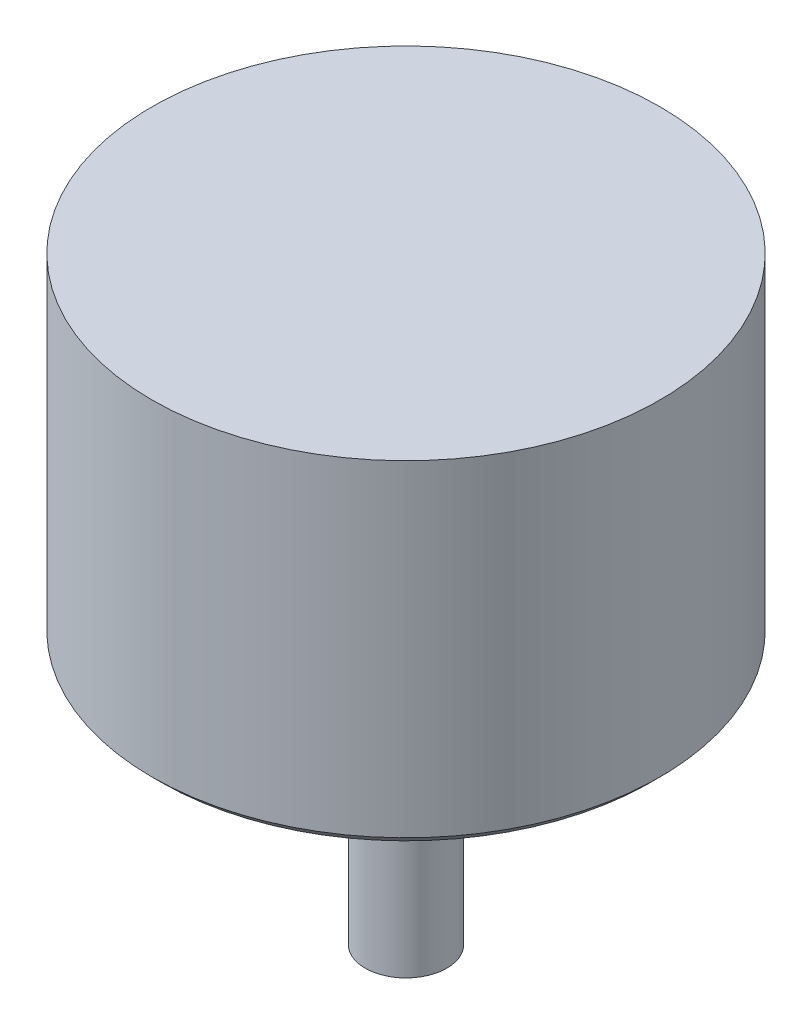
ISO-10303-21;
HEADER;
FILE_DESCRIPTION(('STEP AP214'),'2;1');
FILE_NAME('part.step','',(''),(''),'','','');
FILE_SCHEMA(('AUTOMOTIVE_DESIGN { 1 0 10303 214 1 1 1 1 }'));
ENDSEC;
DATA;
#1=APPLICATION_CONTEXT('core data for automotive mechanical design processes');
#2=APPLICATION_PROTOCOL_DEFINITION('international standard','automotive_design',2000,#1);
#3=PRODUCT_CONTEXT('',#1,'mechanical');
#4=PRODUCT('Part','Part','',(#3));
#5=PRODUCT_RELATED_PRODUCT_CATEGORY('part','',(#4));
#6=PRODUCT_DEFINITION_FORMATION('','',#4);
#7=PRODUCT_DEFINITION_CONTEXT('part definition',#1,'design');
#8=PRODUCT_DEFINITION('design','',#6,#7);
#9=PRODUCT_DEFINITION_SHAPE('','',#8);
#10=(LENGTH_UNIT() NAMED_UNIT(*) SI_UNIT(.MILLI.,.METRE.));
#11=(NAMED_UNIT(*) PLANE_ANGLE_UNIT() SI_UNIT($,.RADIAN.));
#12=(NAMED_UNIT(*) SI_UNIT($,.STERADIAN.) SOLID_ANGLE_UNIT());
#13=UNCERTAINTY_MEASURE_WITH_UNIT(LENGTH_MEASURE(1.E-05),#10,'distance_accuracy_value','');
#14=(GEOMETRIC_REPRESENTATION_CONTEXT(3) GLOBAL_UNCERTAINTY_ASSIGNED_CONTEXT((#13)) GLOBAL_UNIT_ASSIGNED_CONTEXT((#10,
#11,#12)) REPRESENTATION_CONTEXT('',''));
#15=CARTESIAN_POINT('',(0.,0.,0.));
#16=DIRECTION('',(0.,0.,1.));
#17=DIRECTION('',(1.,0.,0.));
#18=AXIS2_PLACEMENT_3D('',#15,#16,#17);
#19=CARTESIAN_POINT('',(0.,-1.,0.));
#20=DIRECTION('',(0.,1.,0.));
#21=DIRECTION('',(0.,0.,1.));
#22=AXIS2_PLACEMENT_3D('',#19,#20,#21);
#23=CYLINDRICAL_SURFACE('',#22,4.);
#24=CARTESIAN_POINT('',(0.,-1.,0.));
#25=DIRECTION('',(0.,-1.,0.));
#26=DIRECTION('',(0.,0.,-1.));
#27=AXIS2_PLACEMENT_3D('',#24,#25,#26);
#28=CIRCLE('',#27,4.);
#29=CARTESIAN_POINT('',(0.,-1.,-4.));
#30=VERTEX_POINT('',#29);
#31=EDGE_CURVE('E57',#30,#30,#28,.T.);
#32=ORIENTED_EDGE('',*,*,#31,.F.);
#33=EDGE_LOOP('',(#32));
#34=FACE_BOUND('',#33,.T.);
#35=CARTESIAN_POINT('',(0.,0.,0.));
#36=DIRECTION('',(0.,1.,0.));
#37=DIRECTION('',(0.,0.,1.));
#38=AXIS2_PLACEMENT_3D('',#35,#36,#37);
#39=CIRCLE('',#38,4.);
#40=CARTESIAN_POINT('',(0.,0.,3.99999999999999));
#41=VERTEX_POINT('',#40);
#42=EDGE_CURVE('E69',#41,#41,#39,.T.);
#43=ORIENTED_EDGE('',*,*,#42,.F.);
#44=EDGE_LOOP('',(#43));
#45=FACE_BOUND('',#44,.T.);
#46=ADVANCED_FACE('F41',(#34,#45),#23,.T.);
#47=CARTESIAN_POINT('',(0.,-1.,0.));
#48=DIRECTION('',(0.,-1.,0.));
#49=DIRECTION('',(0.,0.,-1.));
#50=AXIS2_PLACEMENT_3D('',#47,#48,#49);
#51=PLANE('',#50);
#52=CARTESIAN_POINT('',(0.,-0.999999999999999,0.));
#53=DIRECTION('',(0.,-1.,0.));
#54=DIRECTION('',(0.,0.,-1.));
#55=AXIS2_PLACEMENT_3D('',#52,#53,#54);
#56=CIRCLE('',#55,2.25);
#57=CARTESIAN_POINT('',(0.,-0.999999999999999,-2.25));
#58=VERTEX_POINT('',#57);
#59=EDGE_CURVE('E45',#58,#58,#56,.T.);
#60=ORIENTED_EDGE('',*,*,#59,.F.);
#61=EDGE_LOOP('',(#60));
#62=FACE_BOUND('',#61,.T.);
#63=ORIENTED_EDGE('',*,*,#31,.T.);
#64=EDGE_LOOP('',(#63));
#65=FACE_BOUND('',#64,.T.);
#66=ADVANCED_FACE('F78',(#62,#65),#51,.T.);
#67=CARTESIAN_POINT('',(0.,-14.,0.));
#68=DIRECTION('',(0.,-1.,0.));
#69=DIRECTION('',(0.,0.,-1.));
#70=AXIS2_PLACEMENT_3D('',#67,#68,#69);
#71=PLANE('',#70);
#72=CARTESIAN_POINT('',(0.,-14.,0.));
#73=DIRECTION('',(0.,-1.,0.));
#74=DIRECTION('',(0.,0.,-1.));
#75=AXIS2_PLACEMENT_3D('',#72,#73,#74);
#76=CIRCLE('',#75,2.25);
#77=CARTESIAN_POINT('',(0.,-14.,-2.25));
#78=VERTEX_POINT('',#77);
#79=EDGE_CURVE('E50',#78,#78,#76,.T.);
#80=ORIENTED_EDGE('',*,*,#79,.T.);
#81=EDGE_LOOP('',(#80));
#82=FACE_BOUND('',#81,.T.);
#83=ADVANCED_FACE('F85',(#82),#71,.T.);
#84=CARTESIAN_POINT('',(0.,-14.,0.));
#85=DIRECTION('',(0.,1.,0.));
#86=DIRECTION('',(0.,0.,1.));
#87=AXIS2_PLACEMENT_3D('',#84,#85,#86);
#88=CYLINDRICAL_SURFACE('',#87,2.25);
#89=ORIENTED_EDGE('',*,*,#59,.T.);
#90=EDGE_LOOP('',(#89));
#91=FACE_BOUND('',#90,.T.);
#92=ORIENTED_EDGE('',*,*,#79,.F.);
#93=EDGE_LOOP('',(#92));
#94=FACE_BOUND('',#93,.T.);
#95=ADVANCED_FACE('F92',(#91,#94),#88,.T.);
#96=CARTESIAN_POINT('',(0.,0.500616404156556,0.));
#97=DIRECTION('',(0.,1.,0.));
#98=DIRECTION('',(0.,0.,1.));
#99=AXIS2_PLACEMENT_3D('',#96,#97,#98);
#100=CONICAL_SURFACE('',#99,13.4993835958434,1.51814515005209);
#101=CARTESIAN_POINT('',(0.,0.500616404156556,0.));
#102=DIRECTION('',(0.,1.,0.));
#103=DIRECTION('',(0.,0.,1.));
#104=AXIS2_PLACEMENT_3D('',#101,#102,#103);
#105=CIRCLE('',#104,13.4993835958434);
#106=CARTESIAN_POINT('',(0.,0.500616404156556,13.4993835958434));
#107=VERTEX_POINT('',#106);
#108=EDGE_CURVE('E61',#107,#107,#105,.T.);
#109=CARTESIAN_POINT('',(0.,0.,3.99999999999999));
#110=CARTESIAN_POINT('',(0.,0.00521475420996413,4.09895191245669));
#111=CARTESIAN_POINT('',(0.,0.0104295084199283,4.1979038249134));
#112=CARTESIAN_POINT('',(0.,0.0208590168398565,4.3958076498268));
#113=CARTESIAN_POINT('',(0.,0.0260737710498206,4.4947595622835));
#114=CARTESIAN_POINT('',(0.,0.0365032794697489,4.69266338719691));
#115=CARTESIAN_POINT('',(0.,0.041718033679713,4.79161529965361));
#116=CARTESIAN_POINT('',(0.,0.0521475420996412,4.98951912456702));
#117=CARTESIAN_POINT('',(0.,0.0573622963096054,5.08847103702372));
#118=CARTESIAN_POINT('',(0.,0.0677918047295337,5.28637486193712));
#119=CARTESIAN_POINT('',(0.,0.0730065589394978,5.38532677439383));
#120=CARTESIAN_POINT('',(0.,0.083436067359426,5.58323059930723));
#121=CARTESIAN_POINT('',(0.,0.0886508215693901,5.68218251176394));
#122=CARTESIAN_POINT('',(0.,0.0990803299893184,5.88008633667734));
#123=CARTESIAN_POINT('',(0.,0.104295084199283,5.97903824913404));
#124=CARTESIAN_POINT('',(0.,0.114724592619211,6.17694207404745));
#125=CARTESIAN_POINT('',(0.,0.119939346829175,6.27589398650415));
#126=CARTESIAN_POINT('',(0.,0.130368855249103,6.47379781141756));
#127=CARTESIAN_POINT('',(0.,0.135583609459067,6.57274972387426));
#128=CARTESIAN_POINT('',(0.,0.146013117878996,6.77065354878766));
#129=CARTESIAN_POINT('',(0.,0.15122787208896,6.86960546124437));
#130=CARTESIAN_POINT('',(0.,0.161657380508888,7.06750928615777));
#131=CARTESIAN_POINT('',(0.,0.166872134718852,7.16646119861447));
#132=CARTESIAN_POINT('',(0.,0.17730164313878,7.36436502352788));
#133=CARTESIAN_POINT('',(0.,0.182516397348744,7.46331693598458));
#134=CARTESIAN_POINT('',(0.,0.192945905768673,7.66122076089799));
#135=CARTESIAN_POINT('',(0.,0.198160659978637,7.76017267335469));
#136=CARTESIAN_POINT('',(0.,0.208590168398565,7.95807649826809));
#137=CARTESIAN_POINT('',(0.,0.213804922608529,8.0570284107248));
#138=CARTESIAN_POINT('',(0.,0.224234431028457,8.2549322356382));
#139=CARTESIAN_POINT('',(0.,0.229449185238422,8.3538841480949));
#140=CARTESIAN_POINT('',(0.,0.23987869365835,8.55178797300831));
#141=CARTESIAN_POINT('',(0.,0.245093447868314,8.65073988546501));
#142=CARTESIAN_POINT('',(0.,0.255522956288242,8.84864371037842));
#143=CARTESIAN_POINT('',(0.,0.260737710498206,8.94759562283512));
#144=CARTESIAN_POINT('',(0.,0.271167218918135,9.14549944774853));
#145=CARTESIAN_POINT('',(0.,0.276381973128099,9.24445136020523));
#146=CARTESIAN_POINT('',(0.,0.286811481548027,9.44235518511863));
#147=CARTESIAN_POINT('',(0.,0.292026235757991,9.54130709757534));
#148=CARTESIAN_POINT('',(0.,0.302455744177919,9.73921092248874));
#149=CARTESIAN_POINT('',(0.,0.307670498387883,9.83816283494544));
#150=CARTESIAN_POINT('',(0.,0.318100006807812,10.0360666598588));
#151=CARTESIAN_POINT('',(0.,0.323314761017776,10.1350185723156));
#152=CARTESIAN_POINT('',(0.,0.333744269437704,10.332922397229));
#153=CARTESIAN_POINT('',(0.,0.338959023647668,10.4318743096857));
#154=CARTESIAN_POINT('',(0.,0.349388532067596,10.6297781345991));
#155=CARTESIAN_POINT('',(0.,0.35460328627756,10.7287300470558));
#156=CARTESIAN_POINT('',(0.,0.365032794697489,10.9266338719692));
#157=CARTESIAN_POINT('',(0.,0.370247548907453,11.0255857844259));
#158=CARTESIAN_POINT('',(0.,0.380677057327381,11.2234896093393));
#159=CARTESIAN_POINT('',(0.,0.385891811537345,11.322441521796));
#160=CARTESIAN_POINT('',(0.,0.396321319957273,11.5203453467094));
#161=CARTESIAN_POINT('',(0.,0.401536074167238,11.6192972591661));
#162=CARTESIAN_POINT('',(0.,0.411965582587166,11.8172010840795));
#163=CARTESIAN_POINT('',(0.,0.41718033679713,11.9161529965362));
#164=CARTESIAN_POINT('',(0.,0.427609845217058,12.1140568214496));
#165=CARTESIAN_POINT('',(0.,0.432824599427022,12.2130087339063));
#166=CARTESIAN_POINT('',(0.,0.443254107846951,12.4109125588197));
#167=CARTESIAN_POINT('',(0.,0.448468862056915,12.5098644712764));
#168=CARTESIAN_POINT('',(0.,0.458898370476843,12.7077682961898));
#169=CARTESIAN_POINT('',(0.,0.464113124686807,12.8067202086465));
#170=CARTESIAN_POINT('',(0.,0.474542633106735,13.0046240335599));
#171=CARTESIAN_POINT('',(0.,0.4797573873167,13.1035759460166));
#172=CARTESIAN_POINT('',(0.,0.490186895736628,13.30147977093));
#173=CARTESIAN_POINT('',(0.,0.495401649946592,13.4004316833867));
#174=CARTESIAN_POINT('',(0.,0.500616404156556,13.4993835958434));
#175=B_SPLINE_CURVE_WITH_KNOTS('',3,(#109,#110,#111,#112,#113,#114,#115,#116,#117,#118,#119,
#120,#121,#122,#123,#124,#125,#126,#127,#128,#129,#130,#131,#132,#133,#134,#135,#136,#137,#138,
#139,#140,#141,#142,#143,#144,#145,#146,#147,#148,#149,#150,#151,#152,#153,#154,#155,#156,#157,
#158,#159,#160,#161,#162,#163,#164,#165,#166,#167,#168,#169,#170,#171,#172,#173,#174),
.UNSPECIFIED.,.F.,.F.,(4,2,2,2,2,2,2,2,2,2,2,2,2,2,2,2,2,2,2,2,2,2,2,2,2,2,2,2,2,2,2,2,4),(0.,
0.297267676955944,0.594535353911888,0.891803030867833,1.18907070782378,1.48633838477972,
1.78360606173566,2.08087373869161,2.37814141564755,2.6754090926035,2.97267676955944,
3.26994444651538,3.56721212347133,3.86447980042727,4.16174747738321,4.45901515433916,
4.7562828312951,5.05355050825105,5.35081818520699,5.64808586216293,5.94535353911888,
6.24262121607482,6.53988889303076,6.83715656998671,7.13442424694265,7.43169192389859,
7.72895960085454,8.02622727781048,8.32349495476643,8.62076263172237,8.91803030867831,
9.21529798563426,9.5125656625902),.UNSPECIFIED.);
#176=EDGE_CURVE('BSEAM74',#41,#107,#175,.T.);
#177=ORIENTED_EDGE('',*,*,#42,.T.);
#178=ORIENTED_EDGE('',*,*,#108,.F.);
#179=ORIENTED_EDGE('',*,*,#176,.T.);
#180=ORIENTED_EDGE('',*,*,#176,.F.);
#181=EDGE_LOOP('',(#177,#179,#178,#180));
#182=FACE_BOUND('',#181,.T.);
#183=ADVANCED_FACE('F74',(#182),#100,.T.);
#184=CARTESIAN_POINT('',(0.,1.00123280831311,0.));
#185=DIRECTION('',(0.,1.,0.));
#186=DIRECTION('',(0.,0.,1.));
#187=AXIS2_PLACEMENT_3D('',#184,#185,#186);
#188=CONICAL_SURFACE('',#187,14.,0.785398163397455);
#189=ORIENTED_EDGE('',*,*,#108,.T.);
#190=EDGE_LOOP('',(#189));
#191=FACE_BOUND('',#190,.T.);
#192=CARTESIAN_POINT('',(0.,1.00123280831311,0.));
#193=DIRECTION('',(0.,1.,0.));
#194=DIRECTION('',(0.,0.,1.));
#195=AXIS2_PLACEMENT_3D('',#192,#193,#194);
#196=CIRCLE('',#195,14.);
#197=CARTESIAN_POINT('',(0.,1.00123280831311,14.));
#198=VERTEX_POINT('',#197);
#199=EDGE_CURVE('E65',#198,#198,#196,.T.);
#200=ORIENTED_EDGE('',*,*,#199,.F.);
#201=EDGE_LOOP('',(#200));
#202=FACE_BOUND('',#201,.T.);
#203=ADVANCED_FACE('F98',(#191,#202),#188,.T.);
#204=CARTESIAN_POINT('',(0.,19.,0.));
#205=DIRECTION('',(0.,1.,0.));
#206=DIRECTION('',(0.,0.,1.));
#207=AXIS2_PLACEMENT_3D('',#204,#205,#206);
#208=PLANE('',#207);
#209=CARTESIAN_POINT('',(0.,19.,0.));
#210=DIRECTION('',(0.,1.,0.));
#211=DIRECTION('',(0.,0.,1.));
#212=AXIS2_PLACEMENT_3D('',#209,#210,#211);
#213=CIRCLE('',#212,14.);
#214=CARTESIAN_POINT('',(0.,19.,14.));
#215=VERTEX_POINT('',#214);
#216=EDGE_CURVE('E10',#215,#215,#213,.T.);
#217=ORIENTED_EDGE('',*,*,#216,.T.);
#218=EDGE_LOOP('',(#217));
#219=FACE_BOUND('',#218,.T.);
#220=ADVANCED_FACE('F96',(#219),#208,.T.);
#221=CARTESIAN_POINT('',(0.,19.,0.));
#222=DIRECTION('',(0.,-1.,0.));
#223=DIRECTION('',(0.,0.,-1.));
#224=AXIS2_PLACEMENT_3D('',#221,#222,#223);
#225=CYLINDRICAL_SURFACE('',#224,14.);
#226=ORIENTED_EDGE('',*,*,#216,.F.);
#227=EDGE_LOOP('',(#226));
#228=FACE_BOUND('',#227,.T.);
#229=ORIENTED_EDGE('',*,*,#199,.T.);
#230=EDGE_LOOP('',(#229));
#231=FACE_BOUND('',#230,.T.);
#232=ADVANCED_FACE('F43',(#228,#231),#225,.T.);
#233=CLOSED_SHELL('',(#46,#66,#83,#95,#183,#203,#220,#232));
#234=MANIFOLD_SOLID_BREP('B2',#233);
#235=ADVANCED_BREP_SHAPE_REPRESENTATION('',(#18,#234),#14);
#236=SHAPE_DEFINITION_REPRESENTATION(#9,#235);
ENDSEC;
END-ISO-10303-21;
